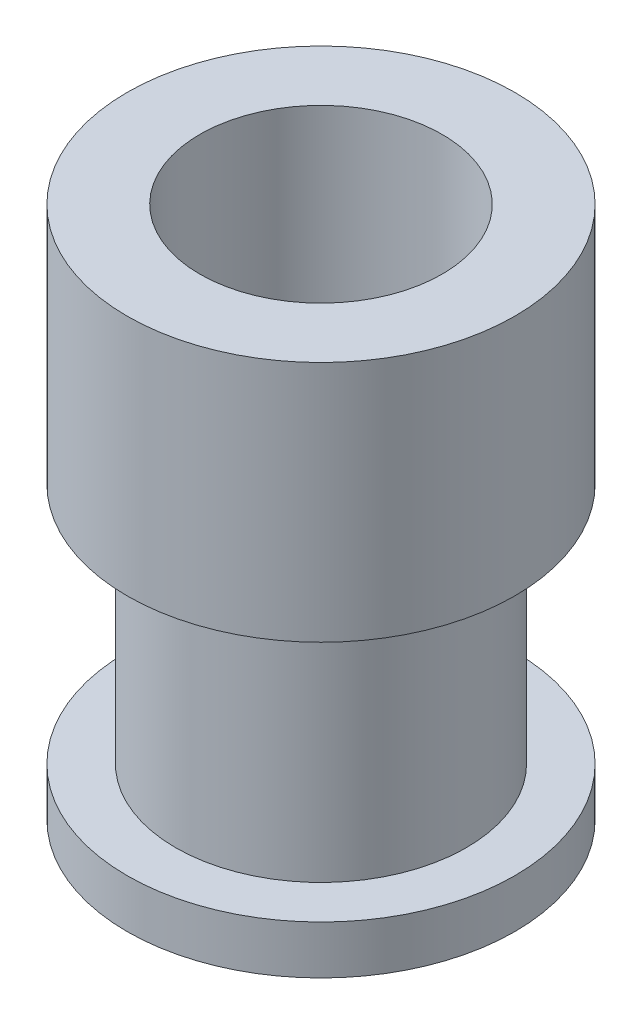
ISO-10303-21;
HEADER;
FILE_DESCRIPTION(('STEP AP214'),'2;1');
FILE_NAME('part.step','',(''),(''),'','','');
FILE_SCHEMA(('AUTOMOTIVE_DESIGN { 1 0 10303 214 1 1 1 1 }'));
ENDSEC;
DATA;
#1=APPLICATION_CONTEXT('core data for automotive mechanical design processes');
#2=APPLICATION_PROTOCOL_DEFINITION('international standard','automotive_design',2000,#1);
#3=PRODUCT_CONTEXT('',#1,'mechanical');
#4=PRODUCT('Part','Part','',(#3));
#5=PRODUCT_RELATED_PRODUCT_CATEGORY('part','',(#4));
#6=PRODUCT_DEFINITION_FORMATION('','',#4);
#7=PRODUCT_DEFINITION_CONTEXT('part definition',#1,'design');
#8=PRODUCT_DEFINITION('design','',#6,#7);
#9=PRODUCT_DEFINITION_SHAPE('','',#8);
#10=(LENGTH_UNIT() NAMED_UNIT(*) SI_UNIT(.MILLI.,.METRE.));
#11=(NAMED_UNIT(*) PLANE_ANGLE_UNIT() SI_UNIT($,.RADIAN.));
#12=(NAMED_UNIT(*) SI_UNIT($,.STERADIAN.) SOLID_ANGLE_UNIT());
#13=UNCERTAINTY_MEASURE_WITH_UNIT(LENGTH_MEASURE(1.E-05),#10,'distance_accuracy_value','');
#14=(GEOMETRIC_REPRESENTATION_CONTEXT(3) GLOBAL_UNCERTAINTY_ASSIGNED_CONTEXT((#13)) GLOBAL_UNIT_ASSIGNED_CONTEXT((#10,
#11,#12)) REPRESENTATION_CONTEXT('',''));
#15=CARTESIAN_POINT('',(0.,0.,0.));
#16=DIRECTION('',(0.,0.,1.));
#17=DIRECTION('',(1.,0.,0.));
#18=AXIS2_PLACEMENT_3D('',#15,#16,#17);
#19=CARTESIAN_POINT('',(0.,10.,0.));
#20=DIRECTION('',(0.,1.,0.));
#21=DIRECTION('',(0.,0.,1.));
#22=AXIS2_PLACEMENT_3D('',#19,#20,#21);
#23=PLANE('',#22);
#24=CARTESIAN_POINT('',(0.,10.,0.));
#25=DIRECTION('',(0.,1.,0.));
#26=DIRECTION('',(0.,0.,1.));
#27=AXIS2_PLACEMENT_3D('',#24,#25,#26);
#28=CIRCLE('',#27,40.);
#29=CARTESIAN_POINT('',(0.,10.,40.));
#30=VERTEX_POINT('',#29);
#31=EDGE_CURVE('E10',#30,#30,#28,.T.);
#32=ORIENTED_EDGE('',*,*,#31,.T.);
#33=EDGE_LOOP('',(#32));
#34=FACE_BOUND('',#33,.T.);
#35=CARTESIAN_POINT('',(0.,10.,0.));
#36=DIRECTION('',(0.,1.,0.));
#37=DIRECTION('',(0.,0.,1.));
#38=AXIS2_PLACEMENT_3D('',#35,#36,#37);
#39=CIRCLE('',#38,30.);
#40=CARTESIAN_POINT('',(0.,10.,30.));
#41=VERTEX_POINT('',#40);
#42=EDGE_CURVE('E51',#41,#41,#39,.T.);
#43=ORIENTED_EDGE('',*,*,#42,.F.);
#44=EDGE_LOOP('',(#43));
#45=FACE_BOUND('',#44,.T.);
#46=ADVANCED_FACE('F35',(#34,#45),#23,.T.);
#47=CARTESIAN_POINT('',(0.,0.,0.));
#48=DIRECTION('',(0.,1.,0.));
#49=DIRECTION('',(0.,0.,1.));
#50=AXIS2_PLACEMENT_3D('',#47,#48,#49);
#51=PLANE('',#50);
#52=CARTESIAN_POINT('',(0.,0.,0.));
#53=DIRECTION('',(0.,1.,0.));
#54=DIRECTION('',(0.,0.,1.));
#55=AXIS2_PLACEMENT_3D('',#52,#53,#54);
#56=CIRCLE('',#55,40.);
#57=CARTESIAN_POINT('',(0.,0.,40.));
#58=VERTEX_POINT('',#57);
#59=EDGE_CURVE('E39',#58,#58,#56,.T.);
#60=ORIENTED_EDGE('',*,*,#59,.F.);
#61=EDGE_LOOP('',(#60));
#62=FACE_BOUND('',#61,.T.);
#63=CARTESIAN_POINT('',(0.,0.,0.));
#64=DIRECTION('',(0.,1.,0.));
#65=DIRECTION('',(0.,0.,1.));
#66=AXIS2_PLACEMENT_3D('',#63,#64,#65);
#67=CIRCLE('',#66,25.);
#68=CARTESIAN_POINT('',(0.,0.,25.));
#69=VERTEX_POINT('',#68);
#70=EDGE_CURVE('E46',#69,#69,#67,.T.);
#71=ORIENTED_EDGE('',*,*,#70,.T.);
#72=EDGE_LOOP('',(#71));
#73=FACE_BOUND('',#72,.T.);
#74=ADVANCED_FACE('F84',(#62,#73),#51,.F.);
#75=CARTESIAN_POINT('',(0.,10.,0.));
#76=DIRECTION('',(0.,-1.,0.));
#77=DIRECTION('',(0.,0.,-1.));
#78=AXIS2_PLACEMENT_3D('',#75,#76,#77);
#79=CYLINDRICAL_SURFACE('',#78,40.);
#80=ORIENTED_EDGE('',*,*,#31,.F.);
#81=EDGE_LOOP('',(#80));
#82=FACE_BOUND('',#81,.T.);
#83=ORIENTED_EDGE('',*,*,#59,.T.);
#84=EDGE_LOOP('',(#83));
#85=FACE_BOUND('',#84,.T.);
#86=ADVANCED_FACE('F37',(#82,#85),#79,.T.);
#87=CARTESIAN_POINT('',(0.,10.,0.));
#88=DIRECTION('',(0.,-1.,0.));
#89=DIRECTION('',(0.,0.,-1.));
#90=AXIS2_PLACEMENT_3D('',#87,#88,#89);
#91=CYLINDRICAL_SURFACE('',#90,25.);
#92=ORIENTED_EDGE('',*,*,#70,.F.);
#93=EDGE_LOOP('',(#92));
#94=FACE_BOUND('',#93,.T.);
#95=CARTESIAN_POINT('',(0.,110.,0.));
#96=DIRECTION('',(0.,1.,0.));
#97=DIRECTION('',(0.,0.,1.));
#98=AXIS2_PLACEMENT_3D('',#95,#96,#97);
#99=CIRCLE('',#98,25.);
#100=CARTESIAN_POINT('',(0.,110.,25.));
#101=VERTEX_POINT('',#100);
#102=EDGE_CURVE('E60',#101,#101,#99,.T.);
#103=ORIENTED_EDGE('',*,*,#102,.T.);
#104=EDGE_LOOP('',(#103));
#105=FACE_BOUND('',#104,.T.);
#106=ADVANCED_FACE('F66',(#94,#105),#91,.F.);
#107=CARTESIAN_POINT('',(0.,60.,0.));
#108=DIRECTION('',(0.,-1.,0.));
#109=DIRECTION('',(0.,0.,-1.));
#110=AXIS2_PLACEMENT_3D('',#107,#108,#109);
#111=CYLINDRICAL_SURFACE('',#110,30.);
#112=CARTESIAN_POINT('',(0.,60.,0.));
#113=DIRECTION('',(0.,1.,0.));
#114=DIRECTION('',(0.,0.,1.));
#115=AXIS2_PLACEMENT_3D('',#112,#113,#114);
#116=CIRCLE('',#115,30.);
#117=CARTESIAN_POINT('',(0.,60.,30.));
#118=VERTEX_POINT('',#117);
#119=EDGE_CURVE('E50',#118,#118,#116,.T.);
#120=ORIENTED_EDGE('',*,*,#119,.F.);
#121=EDGE_LOOP('',(#120));
#122=FACE_BOUND('',#121,.T.);
#123=ORIENTED_EDGE('',*,*,#42,.T.);
#124=EDGE_LOOP('',(#123));
#125=FACE_BOUND('',#124,.T.);
#126=ADVANCED_FACE('F71',(#122,#125),#111,.T.);
#127=CARTESIAN_POINT('',(0.,110.,0.));
#128=DIRECTION('',(0.,1.,0.));
#129=DIRECTION('',(0.,0.,1.));
#130=AXIS2_PLACEMENT_3D('',#127,#128,#129);
#131=PLANE('',#130);
#132=CARTESIAN_POINT('',(0.,110.,0.));
#133=DIRECTION('',(0.,1.,0.));
#134=DIRECTION('',(0.,0.,1.));
#135=AXIS2_PLACEMENT_3D('',#132,#133,#134);
#136=CIRCLE('',#135,40.);
#137=CARTESIAN_POINT('',(0.,110.,40.));
#138=VERTEX_POINT('',#137);
#139=EDGE_CURVE('E54',#138,#138,#136,.T.);
#140=ORIENTED_EDGE('',*,*,#139,.T.);
#141=EDGE_LOOP('',(#140));
#142=FACE_BOUND('',#141,.T.);
#143=ORIENTED_EDGE('',*,*,#102,.F.);
#144=EDGE_LOOP('',(#143));
#145=FACE_BOUND('',#144,.T.);
#146=ADVANCED_FACE('F68',(#142,#145),#131,.T.);
#147=CARTESIAN_POINT('',(0.,60.,0.));
#148=DIRECTION('',(0.,1.,0.));
#149=DIRECTION('',(0.,0.,1.));
#150=AXIS2_PLACEMENT_3D('',#147,#148,#149);
#151=PLANE('',#150);
#152=ORIENTED_EDGE('',*,*,#119,.T.);
#153=EDGE_LOOP('',(#152));
#154=FACE_BOUND('',#153,.T.);
#155=CARTESIAN_POINT('',(0.,60.,0.));
#156=DIRECTION('',(0.,1.,0.));
#157=DIRECTION('',(0.,0.,1.));
#158=AXIS2_PLACEMENT_3D('',#155,#156,#157);
#159=CIRCLE('',#158,40.);
#160=CARTESIAN_POINT('',(0.,60.,40.));
#161=VERTEX_POINT('',#160);
#162=EDGE_CURVE('E57',#161,#161,#159,.T.);
#163=ORIENTED_EDGE('',*,*,#162,.F.);
#164=EDGE_LOOP('',(#163));
#165=FACE_BOUND('',#164,.T.);
#166=ADVANCED_FACE('F70',(#154,#165),#151,.F.);
#167=CARTESIAN_POINT('',(0.,110.,0.));
#168=DIRECTION('',(0.,-1.,0.));
#169=DIRECTION('',(0.,0.,-1.));
#170=AXIS2_PLACEMENT_3D('',#167,#168,#169);
#171=CYLINDRICAL_SURFACE('',#170,40.);
#172=ORIENTED_EDGE('',*,*,#139,.F.);
#173=EDGE_LOOP('',(#172));
#174=FACE_BOUND('',#173,.T.);
#175=ORIENTED_EDGE('',*,*,#162,.T.);
#176=EDGE_LOOP('',(#175));
#177=FACE_BOUND('',#176,.T.);
#178=ADVANCED_FACE('F78',(#174,#177),#171,.T.);
#179=CLOSED_SHELL('',(#46,#74,#86,#106,#126,#146,#166,#178));
#180=MANIFOLD_SOLID_BREP('B2',#179);
#181=ADVANCED_BREP_SHAPE_REPRESENTATION('',(#18,#180),#14);
#182=SHAPE_DEFINITION_REPRESENTATION(#9,#181);
ENDSEC;
END-ISO-10303-21;
